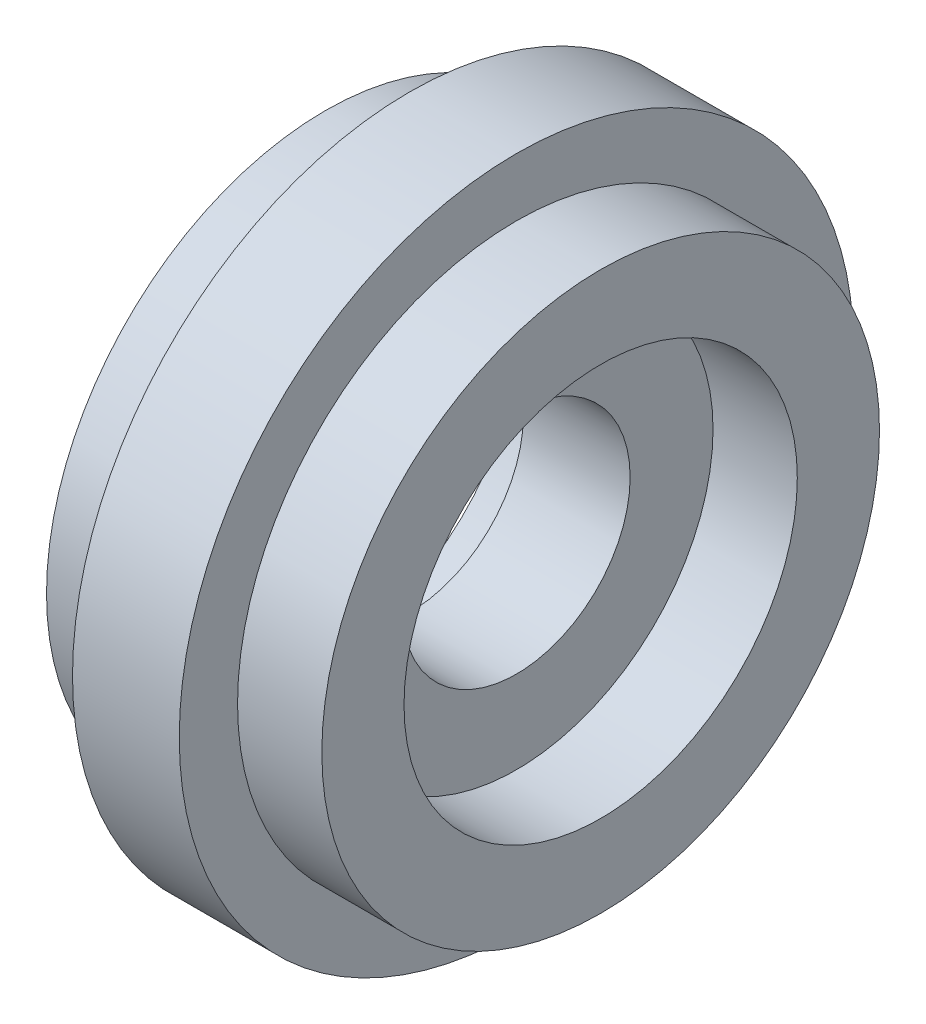
ISO-10303-21;
HEADER;
FILE_DESCRIPTION(('STEP AP214'),'2;1');
FILE_NAME('part.step','',(''),(''),'','','');
FILE_SCHEMA(('AUTOMOTIVE_DESIGN { 1 0 10303 214 1 1 1 1 }'));
ENDSEC;
DATA;
#1=APPLICATION_CONTEXT('core data for automotive mechanical design processes');
#2=APPLICATION_PROTOCOL_DEFINITION('international standard','automotive_design',2000,#1);
#3=PRODUCT_CONTEXT('',#1,'mechanical');
#4=PRODUCT('Part','Part','',(#3));
#5=PRODUCT_RELATED_PRODUCT_CATEGORY('part','',(#4));
#6=PRODUCT_DEFINITION_FORMATION('','',#4);
#7=PRODUCT_DEFINITION_CONTEXT('part definition',#1,'design');
#8=PRODUCT_DEFINITION('design','',#6,#7);
#9=PRODUCT_DEFINITION_SHAPE('','',#8);
#10=(LENGTH_UNIT() NAMED_UNIT(*) SI_UNIT(.MILLI.,.METRE.));
#11=(NAMED_UNIT(*) PLANE_ANGLE_UNIT() SI_UNIT($,.RADIAN.));
#12=(NAMED_UNIT(*) SI_UNIT($,.STERADIAN.) SOLID_ANGLE_UNIT());
#13=UNCERTAINTY_MEASURE_WITH_UNIT(LENGTH_MEASURE(1.E-05),#10,'distance_accuracy_value','');
#14=(GEOMETRIC_REPRESENTATION_CONTEXT(3) GLOBAL_UNCERTAINTY_ASSIGNED_CONTEXT((#13)) GLOBAL_UNIT_ASSIGNED_CONTEXT((#10,
#11,#12)) REPRESENTATION_CONTEXT('',''));
#15=CARTESIAN_POINT('',(0.,0.,0.));
#16=DIRECTION('',(0.,0.,1.));
#17=DIRECTION('',(1.,0.,0.));
#18=AXIS2_PLACEMENT_3D('',#15,#16,#17);
#19=CARTESIAN_POINT('',(0.,0.,0.));
#20=DIRECTION('',(1.,0.,0.));
#21=DIRECTION('',(0.,0.,-1.));
#22=AXIS2_PLACEMENT_3D('',#19,#20,#21);
#23=CYLINDRICAL_SURFACE('',#22,12.);
#24=CARTESIAN_POINT('',(1.9,0.,0.));
#25=DIRECTION('',(1.,0.,0.));
#26=DIRECTION('',(0.,0.,-1.));
#27=AXIS2_PLACEMENT_3D('',#24,#25,#26);
#28=CIRCLE('',#27,12.);
#29=CARTESIAN_POINT('',(1.9,0.,-12.));
#30=VERTEX_POINT('',#29);
#31=EDGE_CURVE('E10',#30,#30,#28,.T.);
#32=ORIENTED_EDGE('',*,*,#31,.F.);
#33=EDGE_LOOP('',(#32));
#34=FACE_BOUND('',#33,.T.);
#35=CARTESIAN_POINT('',(-1.9,0.,0.));
#36=DIRECTION('',(1.,0.,0.));
#37=DIRECTION('',(0.,0.,-1.));
#38=AXIS2_PLACEMENT_3D('',#35,#36,#37);
#39=CIRCLE('',#38,12.);
#40=CARTESIAN_POINT('',(-1.9,0.,-12.));
#41=VERTEX_POINT('',#40);
#42=EDGE_CURVE('E63',#41,#41,#39,.T.);
#43=ORIENTED_EDGE('',*,*,#42,.T.);
#44=EDGE_LOOP('',(#43));
#45=FACE_BOUND('',#44,.T.);
#46=ADVANCED_FACE('F39',(#34,#45),#23,.T.);
#47=CARTESIAN_POINT('',(1.9,12.,0.));
#48=DIRECTION('',(1.,0.,0.));
#49=DIRECTION('',(0.,0.,-1.));
#50=AXIS2_PLACEMENT_3D('',#47,#48,#49);
#51=PLANE('',#50);
#52=ORIENTED_EDGE('',*,*,#31,.T.);
#53=EDGE_LOOP('',(#52));
#54=FACE_BOUND('',#53,.T.);
#55=CARTESIAN_POINT('',(1.9,0.,0.));
#56=DIRECTION('',(1.,0.,0.));
#57=DIRECTION('',(0.,0.,-1.));
#58=AXIS2_PLACEMENT_3D('',#55,#56,#57);
#59=CIRCLE('',#58,9.925);
#60=CARTESIAN_POINT('',(1.9,0.,-9.925));
#61=VERTEX_POINT('',#60);
#62=EDGE_CURVE('E46',#61,#61,#59,.T.);
#63=ORIENTED_EDGE('',*,*,#62,.F.);
#64=EDGE_LOOP('',(#63));
#65=FACE_BOUND('',#64,.T.);
#66=ADVANCED_FACE('F101',(#54,#65),#51,.T.);
#67=CARTESIAN_POINT('',(0.,0.,0.));
#68=DIRECTION('',(1.,0.,0.));
#69=DIRECTION('',(0.,0.,-1.));
#70=AXIS2_PLACEMENT_3D('',#67,#68,#69);
#71=CYLINDRICAL_SURFACE('',#70,9.925);
#72=ORIENTED_EDGE('',*,*,#62,.T.);
#73=EDGE_LOOP('',(#72));
#74=FACE_BOUND('',#73,.T.);
#75=CARTESIAN_POINT('',(4.9,0.,0.));
#76=DIRECTION('',(1.,0.,0.));
#77=DIRECTION('',(0.,0.,-1.));
#78=AXIS2_PLACEMENT_3D('',#75,#76,#77);
#79=CIRCLE('',#78,9.925);
#80=CARTESIAN_POINT('',(4.9,0.,-9.925));
#81=VERTEX_POINT('',#80);
#82=EDGE_CURVE('E49',#81,#81,#79,.T.);
#83=ORIENTED_EDGE('',*,*,#82,.F.);
#84=EDGE_LOOP('',(#83));
#85=FACE_BOUND('',#84,.T.);
#86=ADVANCED_FACE('F107',(#74,#85),#71,.T.);
#87=CARTESIAN_POINT('',(4.9,9.925,0.));
#88=DIRECTION('',(1.,0.,0.));
#89=DIRECTION('',(0.,0.,-1.));
#90=AXIS2_PLACEMENT_3D('',#87,#88,#89);
#91=PLANE('',#90);
#92=ORIENTED_EDGE('',*,*,#82,.T.);
#93=EDGE_LOOP('',(#92));
#94=FACE_BOUND('',#93,.T.);
#95=CARTESIAN_POINT('',(4.9,0.,0.));
#96=DIRECTION('',(1.,0.,0.));
#97=DIRECTION('',(0.,0.,-1.));
#98=AXIS2_PLACEMENT_3D('',#95,#96,#97);
#99=CIRCLE('',#98,7.);
#100=CARTESIAN_POINT('',(4.9,0.,-7.));
#101=VERTEX_POINT('',#100);
#102=EDGE_CURVE('E54',#101,#101,#99,.T.);
#103=ORIENTED_EDGE('',*,*,#102,.F.);
#104=EDGE_LOOP('',(#103));
#105=FACE_BOUND('',#104,.T.);
#106=ADVANCED_FACE('F134',(#94,#105),#91,.T.);
#107=CARTESIAN_POINT('',(0.,0.,0.));
#108=DIRECTION('',(1.,0.,0.));
#109=DIRECTION('',(0.,0.,-1.));
#110=AXIS2_PLACEMENT_3D('',#107,#108,#109);
#111=CYLINDRICAL_SURFACE('',#110,7.);
#112=ORIENTED_EDGE('',*,*,#102,.T.);
#113=EDGE_LOOP('',(#112));
#114=FACE_BOUND('',#113,.T.);
#115=CARTESIAN_POINT('',(1.9,0.,0.));
#116=DIRECTION('',(1.,0.,0.));
#117=DIRECTION('',(0.,0.,-1.));
#118=AXIS2_PLACEMENT_3D('',#115,#116,#117);
#119=CIRCLE('',#118,7.);
#120=CARTESIAN_POINT('',(1.9,0.,-7.));
#121=VERTEX_POINT('',#120);
#122=EDGE_CURVE('E59',#121,#121,#119,.T.);
#123=ORIENTED_EDGE('',*,*,#122,.F.);
#124=EDGE_LOOP('',(#123));
#125=FACE_BOUND('',#124,.T.);
#126=ADVANCED_FACE('F128',(#114,#125),#111,.F.);
#127=CARTESIAN_POINT('',(1.90000000000006,7.,0.));
#128=DIRECTION('',(1.,0.,0.));
#129=DIRECTION('',(0.,0.,-1.));
#130=AXIS2_PLACEMENT_3D('',#127,#128,#129);
#131=PLANE('',#130);
#132=CARTESIAN_POINT('',(1.90000000000006,0.,0.));
#133=DIRECTION('',(1.,0.,0.));
#134=DIRECTION('',(0.,0.,-1.));
#135=AXIS2_PLACEMENT_3D('',#132,#133,#134);
#136=CIRCLE('',#135,4.05);
#137=CARTESIAN_POINT('',(1.90000000000006,0.,-4.05));
#138=VERTEX_POINT('',#137);
#139=EDGE_CURVE('E45',#138,#138,#136,.T.);
#140=ORIENTED_EDGE('',*,*,#139,.F.);
#141=EDGE_LOOP('',(#140));
#142=FACE_BOUND('',#141,.T.);
#143=ORIENTED_EDGE('',*,*,#122,.T.);
#144=EDGE_LOOP('',(#143));
#145=FACE_BOUND('',#144,.T.);
#146=ADVANCED_FACE('F130',(#142,#145),#131,.T.);
#147=CARTESIAN_POINT('',(0.,0.,0.));
#148=DIRECTION('',(-1.,0.,0.));
#149=DIRECTION('',(0.,0.,1.));
#150=AXIS2_PLACEMENT_3D('',#147,#148,#149);
#151=CYLINDRICAL_SURFACE('',#150,4.05);
#152=ORIENTED_EDGE('',*,*,#139,.T.);
#153=EDGE_LOOP('',(#152));
#154=FACE_BOUND('',#153,.T.);
#155=CARTESIAN_POINT('',(-1.90000000000006,0.,0.));
#156=DIRECTION('',(-1.,0.,0.));
#157=DIRECTION('',(0.,0.,1.));
#158=AXIS2_PLACEMENT_3D('',#155,#156,#157);
#159=CIRCLE('',#158,4.05);
#160=CARTESIAN_POINT('',(-1.90000000000006,0.,4.05));
#161=VERTEX_POINT('',#160);
#162=EDGE_CURVE('E78',#161,#161,#159,.T.);
#163=ORIENTED_EDGE('',*,*,#162,.T.);
#164=EDGE_LOOP('',(#163));
#165=FACE_BOUND('',#164,.T.);
#166=ADVANCED_FACE('F77',(#154,#165),#151,.F.);
#167=CARTESIAN_POINT('',(-1.9,12.,0.));
#168=DIRECTION('',(-1.,0.,0.));
#169=DIRECTION('',(0.,0.,-1.));
#170=AXIS2_PLACEMENT_3D('',#167,#168,#169);
#171=PLANE('',#170);
#172=ORIENTED_EDGE('',*,*,#42,.F.);
#173=EDGE_LOOP('',(#172));
#174=FACE_BOUND('',#173,.T.);
#175=CARTESIAN_POINT('',(-1.9,0.,0.));
#176=DIRECTION('',(1.,0.,0.));
#177=DIRECTION('',(0.,0.,-1.));
#178=AXIS2_PLACEMENT_3D('',#175,#176,#177);
#179=CIRCLE('',#178,9.925);
#180=CARTESIAN_POINT('',(-1.9,0.,-9.925));
#181=VERTEX_POINT('',#180);
#182=EDGE_CURVE('E64',#181,#181,#179,.T.);
#183=ORIENTED_EDGE('',*,*,#182,.T.);
#184=EDGE_LOOP('',(#183));
#185=FACE_BOUND('',#184,.T.);
#186=ADVANCED_FACE('F115',(#174,#185),#171,.T.);
#187=CARTESIAN_POINT('',(0.,0.,0.));
#188=DIRECTION('',(-1.,0.,0.));
#189=DIRECTION('',(0.,0.,-1.));
#190=AXIS2_PLACEMENT_3D('',#187,#188,#189);
#191=CYLINDRICAL_SURFACE('',#190,9.925);
#192=ORIENTED_EDGE('',*,*,#182,.F.);
#193=EDGE_LOOP('',(#192));
#194=FACE_BOUND('',#193,.T.);
#195=CARTESIAN_POINT('',(-4.9,0.,0.));
#196=DIRECTION('',(1.,0.,0.));
#197=DIRECTION('',(0.,0.,-1.));
#198=AXIS2_PLACEMENT_3D('',#195,#196,#197);
#199=CIRCLE('',#198,9.925);
#200=CARTESIAN_POINT('',(-4.9,0.,-9.925));
#201=VERTEX_POINT('',#200);
#202=EDGE_CURVE('E66',#201,#201,#199,.T.);
#203=ORIENTED_EDGE('',*,*,#202,.T.);
#204=EDGE_LOOP('',(#203));
#205=FACE_BOUND('',#204,.T.);
#206=ADVANCED_FACE('F96',(#194,#205),#191,.T.);
#207=CARTESIAN_POINT('',(-4.9,9.925,0.));
#208=DIRECTION('',(-1.,0.,0.));
#209=DIRECTION('',(0.,0.,-1.));
#210=AXIS2_PLACEMENT_3D('',#207,#208,#209);
#211=PLANE('',#210);
#212=ORIENTED_EDGE('',*,*,#202,.F.);
#213=EDGE_LOOP('',(#212));
#214=FACE_BOUND('',#213,.T.);
#215=CARTESIAN_POINT('',(-4.9,0.,0.));
#216=DIRECTION('',(1.,0.,0.));
#217=DIRECTION('',(0.,0.,-1.));
#218=AXIS2_PLACEMENT_3D('',#215,#216,#217);
#219=CIRCLE('',#218,7.);
#220=CARTESIAN_POINT('',(-4.9,0.,-7.));
#221=VERTEX_POINT('',#220);
#222=EDGE_CURVE('E67',#221,#221,#219,.T.);
#223=ORIENTED_EDGE('',*,*,#222,.T.);
#224=EDGE_LOOP('',(#223));
#225=FACE_BOUND('',#224,.T.);
#226=ADVANCED_FACE('F89',(#214,#225),#211,.T.);
#227=CARTESIAN_POINT('',(0.,0.,0.));
#228=DIRECTION('',(-1.,0.,0.));
#229=DIRECTION('',(0.,0.,-1.));
#230=AXIS2_PLACEMENT_3D('',#227,#228,#229);
#231=CYLINDRICAL_SURFACE('',#230,7.);
#232=ORIENTED_EDGE('',*,*,#222,.F.);
#233=EDGE_LOOP('',(#232));
#234=FACE_BOUND('',#233,.T.);
#235=CARTESIAN_POINT('',(-1.9,0.,0.));
#236=DIRECTION('',(1.,0.,0.));
#237=DIRECTION('',(0.,0.,-1.));
#238=AXIS2_PLACEMENT_3D('',#235,#236,#237);
#239=CIRCLE('',#238,7.);
#240=CARTESIAN_POINT('',(-1.9,0.,-7.));
#241=VERTEX_POINT('',#240);
#242=EDGE_CURVE('E71',#241,#241,#239,.T.);
#243=ORIENTED_EDGE('',*,*,#242,.T.);
#244=EDGE_LOOP('',(#243));
#245=FACE_BOUND('',#244,.T.);
#246=ADVANCED_FACE('F82',(#234,#245),#231,.F.);
#247=CARTESIAN_POINT('',(-1.90000000000006,7.,0.));
#248=DIRECTION('',(-1.,0.,0.));
#249=DIRECTION('',(0.,0.,-1.));
#250=AXIS2_PLACEMENT_3D('',#247,#248,#249);
#251=PLANE('',#250);
#252=ORIENTED_EDGE('',*,*,#162,.F.);
#253=EDGE_LOOP('',(#252));
#254=FACE_BOUND('',#253,.T.);
#255=ORIENTED_EDGE('',*,*,#242,.F.);
#256=EDGE_LOOP('',(#255));
#257=FACE_BOUND('',#256,.T.);
#258=ADVANCED_FACE('F81',(#254,#257),#251,.T.);
#259=CLOSED_SHELL('',(#46,#66,#86,#106,#126,#146,#166,#186,#206,#226,#246,#258));
#260=MANIFOLD_SOLID_BREP('B2',#259);
#261=ADVANCED_BREP_SHAPE_REPRESENTATION('',(#18,#260),#14);
#262=SHAPE_DEFINITION_REPRESENTATION(#9,#261);
ENDSEC;
END-ISO-10303-21;
